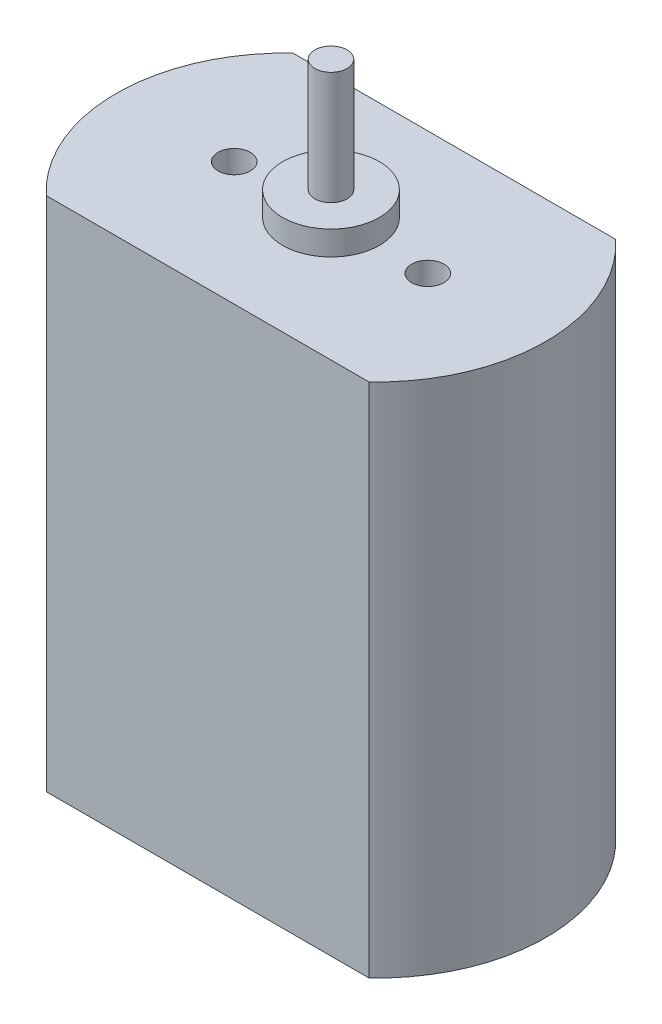
ISO-10303-21;
HEADER;
FILE_DESCRIPTION(('STEP AP214'),'2;1');
FILE_NAME('part.step','',(''),(''),'','','');
FILE_SCHEMA(('AUTOMOTIVE_DESIGN { 1 0 10303 214 1 1 1 1 }'));
ENDSEC;
DATA;
#1=APPLICATION_CONTEXT('core data for automotive mechanical design processes');
#2=APPLICATION_PROTOCOL_DEFINITION('international standard','automotive_design',2000,#1);
#3=PRODUCT_CONTEXT('',#1,'mechanical');
#4=PRODUCT('Part','Part','',(#3));
#5=PRODUCT_RELATED_PRODUCT_CATEGORY('part','',(#4));
#6=PRODUCT_DEFINITION_FORMATION('','',#4);
#7=PRODUCT_DEFINITION_CONTEXT('part definition',#1,'design');
#8=PRODUCT_DEFINITION('design','',#6,#7);
#9=PRODUCT_DEFINITION_SHAPE('','',#8);
#10=(LENGTH_UNIT() NAMED_UNIT(*) SI_UNIT(.MILLI.,.METRE.));
#11=(NAMED_UNIT(*) PLANE_ANGLE_UNIT() SI_UNIT($,.RADIAN.));
#12=(NAMED_UNIT(*) SI_UNIT($,.STERADIAN.) SOLID_ANGLE_UNIT());
#13=UNCERTAINTY_MEASURE_WITH_UNIT(LENGTH_MEASURE(1.E-05),#10,'distance_accuracy_value','');
#14=(GEOMETRIC_REPRESENTATION_CONTEXT(3) GLOBAL_UNCERTAINTY_ASSIGNED_CONTEXT((#13)) GLOBAL_UNIT_ASSIGNED_CONTEXT((#10,
#11,#12)) REPRESENTATION_CONTEXT('',''));
#15=CARTESIAN_POINT('',(0.,0.,0.));
#16=DIRECTION('',(0.,0.,1.));
#17=DIRECTION('',(1.,0.,0.));
#18=AXIS2_PLACEMENT_3D('',#15,#16,#17);
#19=CARTESIAN_POINT('',(2.84028163227513,32.,0.));
#20=DIRECTION('',(0.,-1.,0.));
#21=DIRECTION('',(0.,0.,-1.));
#22=AXIS2_PLACEMENT_3D('',#19,#20,#21);
#23=CYLINDRICAL_SURFACE('',#22,10.4777892279401);
#24=CARTESIAN_POINT('',(2.84028163227513,0.,0.));
#25=DIRECTION('',(0.,1.,0.));
#26=DIRECTION('',(0.,0.,1.));
#27=AXIS2_PLACEMENT_3D('',#24,#25,#26);
#28=CIRCLE('',#27,10.4777892279401);
#29=CARTESIAN_POINT('',(10.,0.,7.65));
#30=VERTEX_POINT('',#29);
#31=CARTESIAN_POINT('',(10.,0.,-7.65));
#32=VERTEX_POINT('',#31);
#33=EDGE_CURVE('E111',#30,#32,#28,.T.);
#34=ORIENTED_EDGE('',*,*,#33,.T.);
#35=DIRECTION('',(0.,-1.,0.));
#36=VECTOR('',#35,1.);
#37=CARTESIAN_POINT('',(10.,32.,-7.65));
#38=LINE('',#37,#36);
#39=CARTESIAN_POINT('',(10.,32.,-7.65));
#40=VERTEX_POINT('',#39);
#41=EDGE_CURVE('E42',#40,#32,#38,.T.);
#42=ORIENTED_EDGE('',*,*,#41,.F.);
#43=CARTESIAN_POINT('',(2.84028163227513,32.,0.));
#44=DIRECTION('',(0.,1.,0.));
#45=DIRECTION('',(0.,0.,1.));
#46=AXIS2_PLACEMENT_3D('',#43,#44,#45);
#47=CIRCLE('',#46,10.4777892279401);
#48=CARTESIAN_POINT('',(10.,32.,7.65));
#49=VERTEX_POINT('',#48);
#50=EDGE_CURVE('E94',#49,#40,#47,.T.);
#51=ORIENTED_EDGE('',*,*,#50,.F.);
#52=DIRECTION('',(0.,-1.,0.));
#53=VECTOR('',#52,1.);
#54=CARTESIAN_POINT('',(10.,32.,7.65));
#55=LINE('',#54,#53);
#56=EDGE_CURVE('E107',#49,#30,#55,.T.);
#57=ORIENTED_EDGE('',*,*,#56,.T.);
#58=EDGE_LOOP('',(#34,#42,#51,#57));
#59=FACE_BOUND('',#58,.T.);
#60=ADVANCED_FACE('F39',(#59),#23,.T.);
#61=CARTESIAN_POINT('',(-10.,32.,-7.65));
#62=DIRECTION('',(0.,0.,1.));
#63=DIRECTION('',(1.,0.,0.));
#64=AXIS2_PLACEMENT_3D('',#61,#62,#63);
#65=PLANE('',#64);
#66=DIRECTION('',(-1.,0.,0.));
#67=VECTOR('',#66,1.);
#68=CARTESIAN_POINT('',(-10.,0.,-7.65));
#69=LINE('',#68,#67);
#70=CARTESIAN_POINT('',(-10.,0.,-7.65));
#71=VERTEX_POINT('',#70);
#72=EDGE_CURVE('E100',#32,#71,#69,.T.);
#73=ORIENTED_EDGE('',*,*,#72,.T.);
#74=DIRECTION('',(0.,-1.,0.));
#75=VECTOR('',#74,1.);
#76=CARTESIAN_POINT('',(-10.,32.,-7.65));
#77=LINE('',#76,#75);
#78=CARTESIAN_POINT('',(-10.,32.,-7.65));
#79=VERTEX_POINT('',#78);
#80=EDGE_CURVE('E98',#79,#71,#77,.T.);
#81=ORIENTED_EDGE('',*,*,#80,.F.);
#82=DIRECTION('',(-1.,0.,0.));
#83=VECTOR('',#82,1.);
#84=CARTESIAN_POINT('',(-10.,32.,-7.65));
#85=LINE('',#84,#83);
#86=EDGE_CURVE('E89',#40,#79,#85,.T.);
#87=ORIENTED_EDGE('',*,*,#86,.F.);
#88=ORIENTED_EDGE('',*,*,#41,.T.);
#89=EDGE_LOOP('',(#73,#81,#87,#88));
#90=FACE_BOUND('',#89,.T.);
#91=ADVANCED_FACE('F99',(#90),#65,.F.);
#92=CARTESIAN_POINT('',(-2.84028163227513,32.,0.));
#93=DIRECTION('',(0.,-1.,0.));
#94=DIRECTION('',(0.,0.,-1.));
#95=AXIS2_PLACEMENT_3D('',#92,#93,#94);
#96=CYLINDRICAL_SURFACE('',#95,10.4777892279401);
#97=CARTESIAN_POINT('',(-2.84028163227513,0.,0.));
#98=DIRECTION('',(0.,1.,0.));
#99=DIRECTION('',(0.,0.,-1.));
#100=AXIS2_PLACEMENT_3D('',#97,#98,#99);
#101=CIRCLE('',#100,10.4777892279401);
#102=CARTESIAN_POINT('',(-10.,0.,7.65));
#103=VERTEX_POINT('',#102);
#104=EDGE_CURVE('E75',#71,#103,#101,.T.);
#105=ORIENTED_EDGE('',*,*,#104,.T.);
#106=DIRECTION('',(0.,-1.,0.));
#107=VECTOR('',#106,1.);
#108=CARTESIAN_POINT('',(-10.,32.,7.65));
#109=LINE('',#108,#107);
#110=CARTESIAN_POINT('',(-10.,32.,7.65));
#111=VERTEX_POINT('',#110);
#112=EDGE_CURVE('E102',#111,#103,#109,.T.);
#113=ORIENTED_EDGE('',*,*,#112,.F.);
#114=CARTESIAN_POINT('',(-2.84028163227513,32.,0.));
#115=DIRECTION('',(0.,1.,0.));
#116=DIRECTION('',(0.,0.,-1.));
#117=AXIS2_PLACEMENT_3D('',#114,#115,#116);
#118=CIRCLE('',#117,10.4777892279401);
#119=EDGE_CURVE('E92',#79,#111,#118,.T.);
#120=ORIENTED_EDGE('',*,*,#119,.F.);
#121=ORIENTED_EDGE('',*,*,#80,.T.);
#122=EDGE_LOOP('',(#105,#113,#120,#121));
#123=FACE_BOUND('',#122,.T.);
#124=ADVANCED_FACE('F103',(#123),#96,.T.);
#125=CARTESIAN_POINT('',(-10.,32.,7.65));
#126=DIRECTION('',(0.,0.,-1.));
#127=DIRECTION('',(-1.,0.,0.));
#128=AXIS2_PLACEMENT_3D('',#125,#126,#127);
#129=PLANE('',#128);
#130=DIRECTION('',(1.,0.,0.));
#131=VECTOR('',#130,1.);
#132=CARTESIAN_POINT('',(-10.,0.,7.65));
#133=LINE('',#132,#131);
#134=EDGE_CURVE('E81',#103,#30,#133,.T.);
#135=ORIENTED_EDGE('',*,*,#134,.T.);
#136=ORIENTED_EDGE('',*,*,#56,.F.);
#137=DIRECTION('',(1.,0.,0.));
#138=VECTOR('',#137,1.);
#139=CARTESIAN_POINT('',(-10.,32.,7.65));
#140=LINE('',#139,#138);
#141=EDGE_CURVE('E58',#111,#49,#140,.T.);
#142=ORIENTED_EDGE('',*,*,#141,.F.);
#143=ORIENTED_EDGE('',*,*,#112,.T.);
#144=EDGE_LOOP('',(#135,#136,#142,#143));
#145=FACE_BOUND('',#144,.T.);
#146=ADVANCED_FACE('F125',(#145),#129,.F.);
#147=CARTESIAN_POINT('',(2.84028163227513,32.,0.));
#148=DIRECTION('',(0.,1.,0.));
#149=DIRECTION('',(0.,0.,1.));
#150=AXIS2_PLACEMENT_3D('',#147,#148,#149);
#151=PLANE('',#150);
#152=CARTESIAN_POINT('',(-6.,32.,0.));
#153=DIRECTION('',(0.,1.,0.));
#154=DIRECTION('',(0.,0.,1.));
#155=AXIS2_PLACEMENT_3D('',#152,#153,#154);
#156=CIRCLE('',#155,1.);
#157=CARTESIAN_POINT('',(-6.,32.,1.));
#158=VERTEX_POINT('',#157);
#159=EDGE_CURVE('E148',#158,#158,#156,.T.);
#160=ORIENTED_EDGE('',*,*,#159,.F.);
#161=EDGE_LOOP('',(#160));
#162=FACE_BOUND('',#161,.T.);
#163=CARTESIAN_POINT('',(6.,32.,0.));
#164=DIRECTION('',(0.,1.,0.));
#165=DIRECTION('',(0.,0.,1.));
#166=AXIS2_PLACEMENT_3D('',#163,#164,#165);
#167=CIRCLE('',#166,1.);
#168=CARTESIAN_POINT('',(6.,32.,1.));
#169=VERTEX_POINT('',#168);
#170=EDGE_CURVE('E139',#169,#169,#167,.T.);
#171=ORIENTED_EDGE('',*,*,#170,.F.);
#172=EDGE_LOOP('',(#171));
#173=FACE_BOUND('',#172,.T.);
#174=CARTESIAN_POINT('',(0.,32.,0.));
#175=DIRECTION('',(0.,1.,0.));
#176=DIRECTION('',(0.,0.,1.));
#177=AXIS2_PLACEMENT_3D('',#174,#175,#176);
#178=CIRCLE('',#177,3.);
#179=CARTESIAN_POINT('',(0.,32.,3.));
#180=VERTEX_POINT('',#179);
#181=EDGE_CURVE('E49',#180,#180,#178,.T.);
#182=ORIENTED_EDGE('',*,*,#181,.F.);
#183=EDGE_LOOP('',(#182));
#184=FACE_BOUND('',#183,.T.);
#185=ORIENTED_EDGE('',*,*,#50,.T.);
#186=ORIENTED_EDGE('',*,*,#86,.T.);
#187=ORIENTED_EDGE('',*,*,#119,.T.);
#188=ORIENTED_EDGE('',*,*,#141,.T.);
#189=EDGE_LOOP('',(#185,#186,#187,#188));
#190=FACE_BOUND('',#189,.T.);
#191=ADVANCED_FACE('F90',(#162,#173,#184,#190),#151,.T.);
#192=CARTESIAN_POINT('',(2.84028163227513,0.,0.));
#193=DIRECTION('',(0.,1.,0.));
#194=DIRECTION('',(0.,0.,1.));
#195=AXIS2_PLACEMENT_3D('',#192,#193,#194);
#196=PLANE('',#195);
#197=ORIENTED_EDGE('',*,*,#33,.F.);
#198=ORIENTED_EDGE('',*,*,#134,.F.);
#199=ORIENTED_EDGE('',*,*,#104,.F.);
#200=ORIENTED_EDGE('',*,*,#72,.F.);
#201=EDGE_LOOP('',(#197,#198,#199,#200));
#202=FACE_BOUND('',#201,.T.);
#203=ADVANCED_FACE('F128',(#202),#196,.F.);
#204=CARTESIAN_POINT('',(0.,33.5,0.));
#205=DIRECTION('',(0.,-1.,0.));
#206=DIRECTION('',(0.,0.,-1.));
#207=AXIS2_PLACEMENT_3D('',#204,#205,#206);
#208=CYLINDRICAL_SURFACE('',#207,3.);
#209=CARTESIAN_POINT('',(0.,33.5,0.));
#210=DIRECTION('',(0.,1.,0.));
#211=DIRECTION('',(0.,0.,1.));
#212=AXIS2_PLACEMENT_3D('',#209,#210,#211);
#213=CIRCLE('',#212,3.);
#214=CARTESIAN_POINT('',(0.,33.5,3.));
#215=VERTEX_POINT('',#214);
#216=EDGE_CURVE('E115',#215,#215,#213,.T.);
#217=ORIENTED_EDGE('',*,*,#216,.F.);
#218=EDGE_LOOP('',(#217));
#219=FACE_BOUND('',#218,.T.);
#220=ORIENTED_EDGE('',*,*,#181,.T.);
#221=EDGE_LOOP('',(#220));
#222=FACE_BOUND('',#221,.T.);
#223=ADVANCED_FACE('F172',(#219,#222),#208,.T.);
#224=CARTESIAN_POINT('',(0.,33.5,0.));
#225=DIRECTION('',(0.,1.,0.));
#226=DIRECTION('',(0.,0.,1.));
#227=AXIS2_PLACEMENT_3D('',#224,#225,#226);
#228=PLANE('',#227);
#229=CARTESIAN_POINT('',(0.,33.5,0.));
#230=DIRECTION('',(0.,1.,0.));
#231=DIRECTION('',(0.,0.,1.));
#232=AXIS2_PLACEMENT_3D('',#229,#230,#231);
#233=CIRCLE('',#232,1.);
#234=CARTESIAN_POINT('',(0.,33.5,1.));
#235=VERTEX_POINT('',#234);
#236=EDGE_CURVE('E11',#235,#235,#233,.T.);
#237=ORIENTED_EDGE('',*,*,#236,.F.);
#238=EDGE_LOOP('',(#237));
#239=FACE_BOUND('',#238,.T.);
#240=ORIENTED_EDGE('',*,*,#216,.T.);
#241=EDGE_LOOP('',(#240));
#242=FACE_BOUND('',#241,.T.);
#243=ADVANCED_FACE('F168',(#239,#242),#228,.T.);
#244=CARTESIAN_POINT('',(6.,30.5,0.));
#245=DIRECTION('',(0.,1.,0.));
#246=DIRECTION('',(0.,0.,1.));
#247=AXIS2_PLACEMENT_3D('',#244,#245,#246);
#248=CYLINDRICAL_SURFACE('',#247,1.);
#249=CARTESIAN_POINT('',(6.,30.5,0.));
#250=DIRECTION('',(0.,1.,0.));
#251=DIRECTION('',(0.,0.,1.));
#252=AXIS2_PLACEMENT_3D('',#249,#250,#251);
#253=CIRCLE('',#252,1.);
#254=CARTESIAN_POINT('',(6.,30.5,1.));
#255=VERTEX_POINT('',#254);
#256=EDGE_CURVE('E143',#255,#255,#253,.T.);
#257=ORIENTED_EDGE('',*,*,#256,.F.);
#258=EDGE_LOOP('',(#257));
#259=FACE_BOUND('',#258,.T.);
#260=ORIENTED_EDGE('',*,*,#170,.T.);
#261=EDGE_LOOP('',(#260));
#262=FACE_BOUND('',#261,.T.);
#263=ADVANCED_FACE('F171',(#259,#262),#248,.F.);
#264=CARTESIAN_POINT('',(6.,30.5,0.));
#265=DIRECTION('',(0.,1.,0.));
#266=DIRECTION('',(0.,0.,1.));
#267=AXIS2_PLACEMENT_3D('',#264,#265,#266);
#268=PLANE('',#267);
#269=ORIENTED_EDGE('',*,*,#256,.T.);
#270=EDGE_LOOP('',(#269));
#271=FACE_BOUND('',#270,.T.);
#272=ADVANCED_FACE('F232',(#271),#268,.T.);
#273=CARTESIAN_POINT('',(-6.,30.5,0.));
#274=DIRECTION('',(0.,1.,0.));
#275=DIRECTION('',(0.,0.,1.));
#276=AXIS2_PLACEMENT_3D('',#273,#274,#275);
#277=CYLINDRICAL_SURFACE('',#276,1.);
#278=CARTESIAN_POINT('',(-6.,30.5,0.));
#279=DIRECTION('',(0.,1.,0.));
#280=DIRECTION('',(0.,0.,1.));
#281=AXIS2_PLACEMENT_3D('',#278,#279,#280);
#282=CIRCLE('',#281,1.);
#283=CARTESIAN_POINT('',(-6.,30.5,1.));
#284=VERTEX_POINT('',#283);
#285=EDGE_CURVE('E138',#284,#284,#282,.T.);
#286=ORIENTED_EDGE('',*,*,#285,.F.);
#287=EDGE_LOOP('',(#286));
#288=FACE_BOUND('',#287,.T.);
#289=ORIENTED_EDGE('',*,*,#159,.T.);
#290=EDGE_LOOP('',(#289));
#291=FACE_BOUND('',#290,.T.);
#292=ADVANCED_FACE('F242',(#288,#291),#277,.F.);
#293=CARTESIAN_POINT('',(-6.,30.5,0.));
#294=DIRECTION('',(0.,1.,0.));
#295=DIRECTION('',(0.,0.,1.));
#296=AXIS2_PLACEMENT_3D('',#293,#294,#295);
#297=PLANE('',#296);
#298=ORIENTED_EDGE('',*,*,#285,.T.);
#299=EDGE_LOOP('',(#298));
#300=FACE_BOUND('',#299,.T.);
#301=ADVANCED_FACE('F164',(#300),#297,.T.);
#302=CARTESIAN_POINT('',(0.,40.5,0.));
#303=DIRECTION('',(0.,-1.,0.));
#304=DIRECTION('',(0.,0.,-1.));
#305=AXIS2_PLACEMENT_3D('',#302,#303,#304);
#306=CYLINDRICAL_SURFACE('',#305,1.);
#307=CARTESIAN_POINT('',(0.,40.5,0.));
#308=DIRECTION('',(0.,1.,0.));
#309=DIRECTION('',(0.,0.,1.));
#310=AXIS2_PLACEMENT_3D('',#307,#308,#309);
#311=CIRCLE('',#310,1.);
#312=CARTESIAN_POINT('',(0.,40.5,1.));
#313=VERTEX_POINT('',#312);
#314=EDGE_CURVE('E144',#313,#313,#311,.T.);
#315=ORIENTED_EDGE('',*,*,#314,.F.);
#316=EDGE_LOOP('',(#315));
#317=FACE_BOUND('',#316,.T.);
#318=ORIENTED_EDGE('',*,*,#236,.T.);
#319=EDGE_LOOP('',(#318));
#320=FACE_BOUND('',#319,.T.);
#321=ADVANCED_FACE('F161',(#317,#320),#306,.T.);
#322=CARTESIAN_POINT('',(0.,40.5,0.));
#323=DIRECTION('',(0.,1.,0.));
#324=DIRECTION('',(0.,0.,1.));
#325=AXIS2_PLACEMENT_3D('',#322,#323,#324);
#326=PLANE('',#325);
#327=ORIENTED_EDGE('',*,*,#314,.T.);
#328=EDGE_LOOP('',(#327));
#329=FACE_BOUND('',#328,.T.);
#330=ADVANCED_FACE('F159',(#329),#326,.T.);
#331=CLOSED_SHELL('',(#60,#91,#124,#146,#191,#203,#223,#243,#263,#272,#292,#301,#321,#330));
#332=MANIFOLD_SOLID_BREP('B2',#331);
#333=ADVANCED_BREP_SHAPE_REPRESENTATION('',(#18,#332),#14);
#334=SHAPE_DEFINITION_REPRESENTATION(#9,#333);
ENDSEC;
END-ISO-10303-21;
